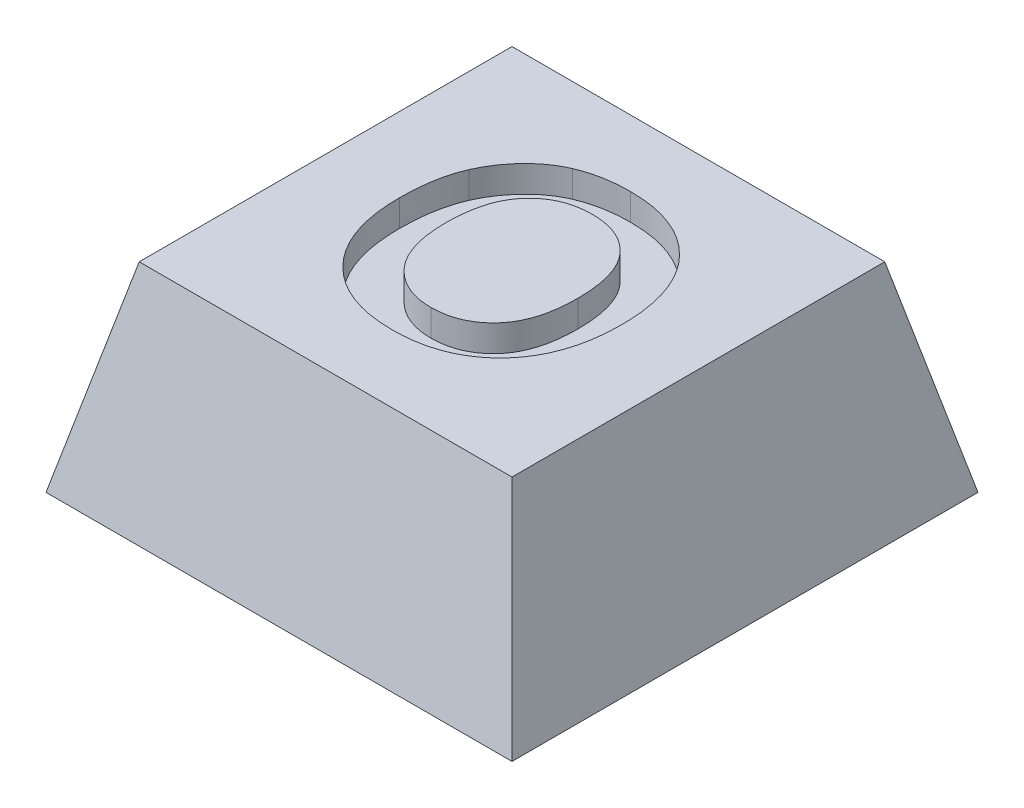
ISO-10303-21;
HEADER;
FILE_DESCRIPTION(('STEP AP214'),'2;1');
FILE_NAME('part.step','',(''),(''),'','','');
FILE_SCHEMA(('AUTOMOTIVE_DESIGN { 1 0 10303 214 1 1 1 1 }'));
ENDSEC;
DATA;
#1=APPLICATION_CONTEXT('core data for automotive mechanical design processes');
#2=APPLICATION_PROTOCOL_DEFINITION('international standard','automotive_design',2000,#1);
#3=PRODUCT_CONTEXT('',#1,'mechanical');
#4=PRODUCT('Part','Part','',(#3));
#5=PRODUCT_RELATED_PRODUCT_CATEGORY('part','',(#4));
#6=PRODUCT_DEFINITION_FORMATION('','',#4);
#7=PRODUCT_DEFINITION_CONTEXT('part definition',#1,'design');
#8=PRODUCT_DEFINITION('design','',#6,#7);
#9=PRODUCT_DEFINITION_SHAPE('','',#8);
#10=(LENGTH_UNIT() NAMED_UNIT(*) SI_UNIT(.MILLI.,.METRE.));
#11=(NAMED_UNIT(*) PLANE_ANGLE_UNIT() SI_UNIT($,.RADIAN.));
#12=(NAMED_UNIT(*) SI_UNIT($,.STERADIAN.) SOLID_ANGLE_UNIT());
#13=UNCERTAINTY_MEASURE_WITH_UNIT(LENGTH_MEASURE(1.E-05),#10,'distance_accuracy_value','');
#14=(GEOMETRIC_REPRESENTATION_CONTEXT(3) GLOBAL_UNCERTAINTY_ASSIGNED_CONTEXT((#13)) GLOBAL_UNIT_ASSIGNED_CONTEXT((#10,
#11,#12)) REPRESENTATION_CONTEXT('',''));
#15=CARTESIAN_POINT('',(0.,0.,0.));
#16=DIRECTION('',(0.,0.,1.));
#17=DIRECTION('',(1.,0.,0.));
#18=AXIS2_PLACEMENT_3D('',#15,#16,#17);
#19=CARTESIAN_POINT('',(0.,3.,0.));
#20=DIRECTION('',(0.,-1.,0.));
#21=DIRECTION('',(0.,0.,-1.));
#22=AXIS2_PLACEMENT_3D('',#19,#20,#21);
#23=PLANE('',#22);
#24=DIRECTION('',(-1.,0.,0.));
#25=VECTOR('',#24,1.);
#26=CARTESIAN_POINT('',(11.,3.,-0.7));
#27=LINE('',#26,#25);
#28=CARTESIAN_POINT('',(6.3,3.,-0.7));
#29=VERTEX_POINT('',#28);
#30=CARTESIAN_POINT('',(0.7,3.,-0.7));
#31=VERTEX_POINT('',#30);
#32=EDGE_CURVE('E300',#29,#31,#27,.T.);
#33=ORIENTED_EDGE('',*,*,#32,.F.);
#34=DIRECTION('',(0.,0.,1.));
#35=VECTOR('',#34,1.);
#36=CARTESIAN_POINT('',(6.3,3.,-7.));
#37=LINE('',#36,#35);
#38=CARTESIAN_POINT('',(6.3,3.,-6.3));
#39=VERTEX_POINT('',#38);
#40=EDGE_CURVE('E312',#39,#29,#37,.T.);
#41=ORIENTED_EDGE('',*,*,#40,.F.);
#42=DIRECTION('',(-1.,0.,0.));
#43=VECTOR('',#42,1.);
#44=CARTESIAN_POINT('',(11.,3.,-6.3));
#45=LINE('',#44,#43);
#46=CARTESIAN_POINT('',(0.699999999999998,3.,-6.3));
#47=VERTEX_POINT('',#46);
#48=EDGE_CURVE('E296',#39,#47,#45,.T.);
#49=ORIENTED_EDGE('',*,*,#48,.T.);
#50=DIRECTION('',(0.,0.,1.));
#51=VECTOR('',#50,1.);
#52=CARTESIAN_POINT('',(0.7,3.,-7.));
#53=LINE('',#52,#51);
#54=EDGE_CURVE('E313',#47,#31,#53,.T.);
#55=ORIENTED_EDGE('',*,*,#54,.T.);
#56=EDGE_LOOP('',(#33,#41,#49,#55));
#57=FACE_BOUND('',#56,.T.);
#58=CARTESIAN_POINT('',(3.4868783656279,3.,-1.7144105566874));
#59=CARTESIAN_POINT('',(3.42488577863911,3.,-1.71596213973714));
#60=CARTESIAN_POINT('',(3.30354847647996,3.,-1.71899903350905));
#61=CARTESIAN_POINT('',(3.12646310417392,3.,-1.74064989999921));
#62=CARTESIAN_POINT('',(2.95924503741864,3.,-1.77775775601154));
#63=CARTESIAN_POINT('',(2.80201335071599,3.,-1.83005335142888));
#64=CARTESIAN_POINT('',(2.65369569519108,3.,-1.89574352108576));
#65=CARTESIAN_POINT('',(2.51566143028609,3.,-1.97751078970332));
#66=CARTESIAN_POINT('',(2.38783425444043,3.,-2.07457615518847));
#67=CARTESIAN_POINT('',(2.2703416712836,3.,-2.18524925836138));
#68=CARTESIAN_POINT('',(2.16382913209137,3.,-2.30845527608443));
#69=CARTESIAN_POINT('',(2.07295207497426,3.,-2.44498024118118));
#70=CARTESIAN_POINT('',(1.99417059212866,3.,-2.59132894507543));
#71=CARTESIAN_POINT('',(1.931542745072,3.,-2.74971822017719));
#72=CARTESIAN_POINT('',(1.88128122169895,3.,-2.9185184438031));
#73=CARTESIAN_POINT('',(1.84702347315421,3.,-3.09870090626541));
#74=CARTESIAN_POINT('',(1.8254060357708,3.,-3.28976969736512));
#75=CARTESIAN_POINT('',(1.82296724088812,3.,-3.4208797622457));
#76=CARTESIAN_POINT('',(1.82171410280738,3.,-3.48824869771304));
#77=B_SPLINE_CURVE_WITH_KNOTS('',3,(#58,#59,#60,#61,#62,#63,#64,#65,#66,#67,#68,#69,#70,#71,#72,
#73,#74,#75,#76),.UNSPECIFIED.,.F.,.F.,(4,1,1,1,1,1,1,1,1,1,1,1,1,1,1,1,4),(0.,
0.0675548908418181,0.132224328755391,0.194080368767538,0.253925152218762,0.312527181287745,
0.370537277971808,0.428355823699205,0.48709717362488,0.546162876751327,0.605432519982998,
0.665482919028343,0.726969728752244,0.790717709645659,0.857154168957074,0.926600817549172,1.),.UNSPECIFIED.);
#78=CARTESIAN_POINT('',(3.4868783656279,3.,-1.7144105566874));
#79=VERTEX_POINT('',#78);
#80=CARTESIAN_POINT('',(1.82171410280738,3.,-3.48824869771304));
#81=VERTEX_POINT('',#80);
#82=EDGE_CURVE('E59',#79,#81,#77,.T.);
#83=ORIENTED_EDGE('',*,*,#82,.T.);
#84=CARTESIAN_POINT('',(1.82171410280738,3.,-3.48824869771304));
#85=CARTESIAN_POINT('',(1.82196178350956,3.,-3.53150025323456));
#86=CARTESIAN_POINT('',(1.82244819643745,3.,-3.61644072527134));
#87=CARTESIAN_POINT('',(1.83087660364378,3.,-3.74105158658262));
#88=CARTESIAN_POINT('',(1.84198590096817,3.,-3.86049574990482));
#89=CARTESIAN_POINT('',(1.86007737378861,3.,-3.97430339719521));
#90=CARTESIAN_POINT('',(1.88135955079986,3.,-4.08300718725822));
#91=CARTESIAN_POINT('',(1.90797790586073,3.,-4.18657485331883));
#92=CARTESIAN_POINT('',(1.94004359780977,3.,-4.28464318629066));
#93=CARTESIAN_POINT('',(1.96555210950307,3.,-4.34725875692655));
#94=CARTESIAN_POINT('',(1.97806426306379,3.,-4.37797225540535));
#95=B_SPLINE_CURVE_WITH_KNOTS('',3,(#84,#85,#86,#87,#88,#89,#90,#91,#92,#93,#94),.UNSPECIFIED.,
.F.,.F.,(4,1,1,1,1,1,1,1,4),(0.,0.142626151542261,0.280099351126508,0.41179758440464,
0.538153649343746,0.660001734469281,0.777041667829733,0.890636940198671,1.),.UNSPECIFIED.);
#96=CARTESIAN_POINT('',(1.97806426306379,3.,-4.37797225540535));
#97=VERTEX_POINT('',#96);
#98=EDGE_CURVE('E225',#81,#97,#95,.T.);
#99=ORIENTED_EDGE('',*,*,#98,.T.);
#100=CARTESIAN_POINT('',(1.97806426306379,3.,-4.37797225540535));
#101=CARTESIAN_POINT('',(1.998516885688,3.,-4.42163505106402));
#102=CARTESIAN_POINT('',(2.03918157465484,3.,-4.50844709651686));
#103=CARTESIAN_POINT('',(2.11470229330953,3.,-4.63111949568779));
#104=CARTESIAN_POINT('',(2.20030057519163,3.,-4.7468095075435));
#105=CARTESIAN_POINT('',(2.2952717129761,3.,-4.85491063757016));
#106=CARTESIAN_POINT('',(2.39719106357061,3.,-4.95379548370455));
#107=CARTESIAN_POINT('',(2.50653943506425,3.,-5.03842667387064));
#108=CARTESIAN_POINT('',(2.61943200816132,3.,-5.11166238307809));
#109=CARTESIAN_POINT('',(2.69972425714822,3.,-5.14849559193813));
#110=CARTESIAN_POINT('',(2.73948253229456,3.,-5.16673427463612));
#111=B_SPLINE_CURVE_WITH_KNOTS('',3,(#100,#101,#102,#103,#104,#105,#106,#107,#108,#109,#110),
.UNSPECIFIED.,.F.,.F.,(4,1,1,1,1,1,1,1,4),(0.,0.128921537361802,0.256326746660807,
0.384644817223719,0.513589100227115,0.640960544758506,0.763920863448044,0.883100805049367,1.),.UNSPECIFIED.);
#112=CARTESIAN_POINT('',(2.73948253229456,3.,-5.16673427463612));
#113=VERTEX_POINT('',#112);
#114=EDGE_CURVE('E234',#97,#113,#111,.T.);
#115=ORIENTED_EDGE('',*,*,#114,.T.);
#116=CARTESIAN_POINT('',(2.73948253229456,3.,-5.16673427463612));
#117=CARTESIAN_POINT('',(2.76647030053949,3.,-5.17780405499253));
#118=CARTESIAN_POINT('',(2.82101946139793,3.,-5.20017890362207));
#119=CARTESIAN_POINT('',(2.90579527825329,3.,-5.22810388710177));
#120=CARTESIAN_POINT('',(2.99378772937256,3.,-5.25079167393255));
#121=CARTESIAN_POINT('',(3.08436037093094,3.,-5.27107191199034));
#122=CARTESIAN_POINT('',(3.1783925876963,3.,-5.28505580345063));
#123=CARTESIAN_POINT('',(3.27512456000823,3.,-5.2967808157109));
#124=CARTESIAN_POINT('',(3.37508566911623,3.,-5.30292609864419));
#125=CARTESIAN_POINT('',(3.44270063077777,3.,-5.30374034510211));
#126=CARTESIAN_POINT('',(3.47706266049969,3.,-5.30415414643099));
#127=B_SPLINE_CURVE_WITH_KNOTS('',3,(#116,#117,#118,#119,#120,#121,#122,#123,#124,#125,#126),
.UNSPECIFIED.,.F.,.F.,(4,1,1,1,1,1,1,1,4),(0.,0.11582419245917,0.234110225358943,
0.354106367101145,0.47662819764766,0.602520909154957,0.73146627476947,0.863530739041159,1.),.UNSPECIFIED.);
#128=CARTESIAN_POINT('',(3.47706266049969,3.,-5.30415414643099));
#129=VERTEX_POINT('',#128);
#130=EDGE_CURVE('E243',#113,#129,#127,.T.);
#131=ORIENTED_EDGE('',*,*,#130,.T.);
#132=CARTESIAN_POINT('',(3.47706266049969,3.,-5.30415414643099));
#133=CARTESIAN_POINT('',(3.53859053571245,3.,-5.30261184463026));
#134=CARTESIAN_POINT('',(3.65900143315827,3.,-5.29959353880844));
#135=CARTESIAN_POINT('',(3.83488794116481,3.,-5.27779267481563));
#136=CARTESIAN_POINT('',(4.00132998116081,3.,-5.24097990896327));
#137=CARTESIAN_POINT('',(4.15776414390691,3.,-5.18777181733149));
#138=CARTESIAN_POINT('',(4.30553915653759,3.,-5.12126054798245));
#139=CARTESIAN_POINT('',(4.44350689488217,3.,-5.0387608923831));
#140=CARTESIAN_POINT('',(4.57187155432904,3.,-4.9411657490069));
#141=CARTESIAN_POINT('',(4.69038520489811,3.,-4.82981346068601));
#142=CARTESIAN_POINT('',(4.79711523595804,3.,-4.70489808627424));
#143=CARTESIAN_POINT('',(4.89006822616152,3.,-4.56758652213554));
#144=CARTESIAN_POINT('',(4.96804321811465,3.,-4.41852222250959));
#145=CARTESIAN_POINT('',(5.03226012610551,3.,-4.25811646270797));
#146=CARTESIAN_POINT('',(5.08160598083309,3.,-4.08584530704998));
#147=CARTESIAN_POINT('',(5.11725831514555,3.,-3.90219483545387));
#148=CARTESIAN_POINT('',(5.13843868794543,3.,-3.70702977469054));
#149=CARTESIAN_POINT('',(5.14094152899522,3.,-3.57313789818657));
#150=CARTESIAN_POINT('',(5.14222692332021,3.,-3.50437449899509));
#151=B_SPLINE_CURVE_WITH_KNOTS('',3,(#132,#133,#134,#135,#136,#137,#138,#139,#140,#141,#142,
#143,#144,#145,#146,#147,#148,#149,#150),.UNSPECIFIED.,.F.,.F.,(4,1,1,1,1,1,1,1,1,1,1,1,1,1,1,1,
4),(0.,0.0665400640507846,0.130219819890614,0.19136249355442,0.250596308078881,
0.308629701058001,0.366331271590809,0.424067714983998,0.482723185884521,0.541891699233788,
0.601416067240712,0.661683488488139,0.723504318995045,0.787984312988148,0.855208444610935,
0.925638808098423,1.),.UNSPECIFIED.);
#152=CARTESIAN_POINT('',(5.14222692332021,3.,-3.50437449899509));
#153=VERTEX_POINT('',#152);
#154=EDGE_CURVE('E252',#129,#153,#151,.T.);
#155=ORIENTED_EDGE('',*,*,#154,.T.);
#156=CARTESIAN_POINT('',(5.14222692332021,3.,-3.50437449899509));
#157=CARTESIAN_POINT('',(5.14097121768169,3.,-3.43607154917613));
#158=CARTESIAN_POINT('',(5.13852659340614,3.,-3.30309846687242));
#159=CARTESIAN_POINT('',(5.11695087590904,3.,-3.10946487462891));
#160=CARTESIAN_POINT('',(5.08277663491198,3.,-2.92715322030312));
#161=CARTESIAN_POINT('',(5.03223680702889,3.,-2.75657997001343));
#162=CARTESIAN_POINT('',(4.96993650429565,3.,-2.59644353598003));
#163=CARTESIAN_POINT('',(4.8911591302425,3.,-2.44865127090717));
#164=CARTESIAN_POINT('',(4.80015285598484,3.,-2.31124280762863));
#165=CARTESIAN_POINT('',(4.69357441541846,3.,-2.18767349426659));
#166=CARTESIAN_POINT('',(4.57705541683294,3.,-2.07568215480642));
#167=CARTESIAN_POINT('',(4.44885358148483,3.,-1.97922765321011));
#168=CARTESIAN_POINT('',(4.3118901804038,3.,-1.89661621486118));
#169=CARTESIAN_POINT('',(4.16492086490947,3.,-1.8299127385405));
#170=CARTESIAN_POINT('',(4.00890355395947,3.,-1.77780044870118));
#171=CARTESIAN_POINT('',(3.8433290955586,3.,-1.74070480373075));
#172=CARTESIAN_POINT('',(3.66811257080752,3.,-1.71898783232248));
#173=CARTESIAN_POINT('',(3.54817083189095,3.,-1.7159585675177));
#174=CARTESIAN_POINT('',(3.4868783656279,3.,-1.7144105566874));
#175=B_SPLINE_CURVE_WITH_KNOTS('',3,(#156,#157,#158,#159,#160,#161,#162,#163,#164,#165,#166,
#167,#168,#169,#170,#171,#172,#173,#174),.UNSPECIFIED.,.F.,.F.,(4,1,1,1,1,1,1,1,1,1,1,1,1,1,1,1,
4),(0.,0.0742781575154445,0.144605695344774,0.211666548904063,0.275782984734484,
0.337863098902652,0.398250193305316,0.457619965753242,0.516768332552388,0.575389852409409,
0.633100216613373,0.690913523227109,0.749047349975616,0.808297797028934,0.869542001331225,
0.933333528808403,1.),.UNSPECIFIED.);
#176=EDGE_CURVE('E261',#153,#79,#175,.T.);
#177=ORIENTED_EDGE('',*,*,#176,.T.);
#178=EDGE_LOOP('',(#83,#99,#115,#131,#155,#177));
#179=FACE_BOUND('',#178,.T.);
#180=ADVANCED_FACE('F43',(#57,#179),#23,.F.);
#181=CARTESIAN_POINT('',(7.,0.,-7.));
#182=DIRECTION('',(-0.973841209741793,-0.227229615606418,0.));
#183=DIRECTION('',(0.227229615606418,-0.973841209741793,0.));
#184=AXIS2_PLACEMENT_3D('',#181,#182,#183);
#185=PLANE('',#184);
#186=DIRECTION('',(-0.221581128241521,0.949633406749377,-0.221581128241521));
#187=VECTOR('',#186,1.);
#188=CARTESIAN_POINT('',(6.6563126252505,1.47294589178357,-0.343687374749499));
#189=LINE('',#188,#187);
#190=CARTESIAN_POINT('',(7.,0.,0.));
#191=VERTEX_POINT('',#190);
#192=EDGE_CURVE('E309',#191,#29,#189,.T.);
#193=ORIENTED_EDGE('',*,*,#192,.F.);
#194=DIRECTION('',(0.,0.,-1.));
#195=VECTOR('',#194,1.);
#196=CARTESIAN_POINT('',(7.,0.,0.));
#197=LINE('',#196,#195);
#198=CARTESIAN_POINT('',(7.,0.,-7.));
#199=VERTEX_POINT('',#198);
#200=EDGE_CURVE('E327',#191,#199,#197,.T.);
#201=ORIENTED_EDGE('',*,*,#200,.T.);
#202=DIRECTION('',(0.221581128241521,-0.949633406749377,-0.221581128241521));
#203=VECTOR('',#202,1.);
#204=CARTESIAN_POINT('',(7.,0.,-7.));
#205=LINE('',#204,#203);
#206=EDGE_CURVE('E303',#39,#199,#205,.T.);
#207=ORIENTED_EDGE('',*,*,#206,.F.);
#208=ORIENTED_EDGE('',*,*,#40,.T.);
#209=EDGE_LOOP('',(#193,#201,#207,#208));
#210=FACE_BOUND('',#209,.T.);
#211=ADVANCED_FACE('F353',(#210),#185,.F.);
#212=CARTESIAN_POINT('',(0.,0.,-7.));
#213=DIRECTION('',(0.973841209741793,-0.227229615606418,0.));
#214=DIRECTION('',(0.227229615606418,0.973841209741793,0.));
#215=AXIS2_PLACEMENT_3D('',#212,#213,#214);
#216=PLANE('',#215);
#217=DIRECTION('',(-0.221581128241521,-0.949633406749378,0.221581128241521));
#218=VECTOR('',#217,1.);
#219=CARTESIAN_POINT('',(0.343687374749499,1.47294589178357,-0.3436873747495));
#220=LINE('',#219,#218);
#221=CARTESIAN_POINT('',(0.,0.,0.));
#222=VERTEX_POINT('',#221);
#223=EDGE_CURVE('E11',#31,#222,#220,.T.);
#224=ORIENTED_EDGE('',*,*,#223,.F.);
#225=ORIENTED_EDGE('',*,*,#54,.F.);
#226=DIRECTION('',(0.221581128241521,0.949633406749377,0.221581128241521));
#227=VECTOR('',#226,1.);
#228=CARTESIAN_POINT('',(0.,0.,-7.));
#229=LINE('',#228,#227);
#230=CARTESIAN_POINT('',(0.,0.,-7.));
#231=VERTEX_POINT('',#230);
#232=EDGE_CURVE('E52',#231,#47,#229,.T.);
#233=ORIENTED_EDGE('',*,*,#232,.F.);
#234=DIRECTION('',(0.,0.,1.));
#235=VECTOR('',#234,1.);
#236=CARTESIAN_POINT('',(0.,0.,0.));
#237=LINE('',#236,#235);
#238=EDGE_CURVE('E317',#231,#222,#237,.T.);
#239=ORIENTED_EDGE('',*,*,#238,.T.);
#240=EDGE_LOOP('',(#224,#225,#233,#239));
#241=FACE_BOUND('',#240,.T.);
#242=ADVANCED_FACE('F347',(#241),#216,.F.);
#243=CARTESIAN_POINT('',(0.,0.,0.));
#244=DIRECTION('',(0.,-1.,0.));
#245=DIRECTION('',(0.,0.,-1.));
#246=AXIS2_PLACEMENT_3D('',#243,#244,#245);
#247=PLANE('',#246);
#248=CARTESIAN_POINT('',(3.5,0.,-3.5));
#249=DIRECTION('',(0.,-1.,0.));
#250=DIRECTION('',(0.,0.,-1.));
#251=AXIS2_PLACEMENT_3D('',#248,#249,#250);
#252=CIRCLE('',#251,1.8);
#253=CARTESIAN_POINT('',(3.5,0.,-5.3));
#254=VERTEX_POINT('',#253);
#255=EDGE_CURVE('E291',#254,#254,#252,.T.);
#256=ORIENTED_EDGE('',*,*,#255,.F.);
#257=EDGE_LOOP('',(#256));
#258=FACE_BOUND('',#257,.T.);
#259=ORIENTED_EDGE('',*,*,#238,.F.);
#260=DIRECTION('',(-1.,0.,0.));
#261=VECTOR('',#260,1.);
#262=CARTESIAN_POINT('',(0.,0.,-7.));
#263=LINE('',#262,#261);
#264=EDGE_CURVE('E331',#199,#231,#263,.T.);
#265=ORIENTED_EDGE('',*,*,#264,.F.);
#266=ORIENTED_EDGE('',*,*,#200,.F.);
#267=DIRECTION('',(1.,0.,0.));
#268=VECTOR('',#267,1.);
#269=CARTESIAN_POINT('',(0.,0.,0.));
#270=LINE('',#269,#268);
#271=EDGE_CURVE('E324',#222,#191,#270,.T.);
#272=ORIENTED_EDGE('',*,*,#271,.F.);
#273=EDGE_LOOP('',(#259,#265,#266,#272));
#274=FACE_BOUND('',#273,.T.);
#275=ADVANCED_FACE('F45',(#258,#274),#247,.T.);
#276=CARTESIAN_POINT('',(11.,3.,-6.3));
#277=DIRECTION('',(0.,0.227229615606418,-0.973841209741793));
#278=DIRECTION('',(0.,0.973841209741793,0.227229615606418));
#279=AXIS2_PLACEMENT_3D('',#276,#277,#278);
#280=PLANE('',#279);
#281=ORIENTED_EDGE('',*,*,#206,.T.);
#282=ORIENTED_EDGE('',*,*,#264,.T.);
#283=ORIENTED_EDGE('',*,*,#232,.T.);
#284=ORIENTED_EDGE('',*,*,#48,.F.);
#285=EDGE_LOOP('',(#281,#282,#283,#284));
#286=FACE_BOUND('',#285,.T.);
#287=ADVANCED_FACE('F336',(#286),#280,.T.);
#288=CARTESIAN_POINT('',(11.,0.,0.));
#289=DIRECTION('',(0.,0.227229615606418,0.973841209741793));
#290=DIRECTION('',(0.,-0.973841209741793,0.227229615606418));
#291=AXIS2_PLACEMENT_3D('',#288,#289,#290);
#292=PLANE('',#291);
#293=ORIENTED_EDGE('',*,*,#192,.T.);
#294=ORIENTED_EDGE('',*,*,#32,.T.);
#295=ORIENTED_EDGE('',*,*,#223,.T.);
#296=ORIENTED_EDGE('',*,*,#271,.T.);
#297=EDGE_LOOP('',(#293,#294,#295,#296));
#298=FACE_BOUND('',#297,.T.);
#299=ADVANCED_FACE('F350',(#298),#292,.T.);
#300=CARTESIAN_POINT('',(3.5,0.8,-3.5));
#301=DIRECTION('',(0.,-1.,0.));
#302=DIRECTION('',(0.,0.,-1.));
#303=AXIS2_PLACEMENT_3D('',#300,#301,#302);
#304=CYLINDRICAL_SURFACE('',#303,1.8);
#305=CARTESIAN_POINT('',(3.5,0.8,-3.5));
#306=DIRECTION('',(0.,-1.,0.));
#307=DIRECTION('',(0.,0.,-1.));
#308=AXIS2_PLACEMENT_3D('',#305,#306,#307);
#309=CIRCLE('',#308,1.8);
#310=CARTESIAN_POINT('',(3.5,0.8,-5.3));
#311=VERTEX_POINT('',#310);
#312=EDGE_CURVE('E292',#311,#311,#309,.T.);
#313=ORIENTED_EDGE('',*,*,#312,.F.);
#314=EDGE_LOOP('',(#313));
#315=FACE_BOUND('',#314,.T.);
#316=ORIENTED_EDGE('',*,*,#255,.T.);
#317=EDGE_LOOP('',(#316));
#318=FACE_BOUND('',#317,.T.);
#319=ADVANCED_FACE('F441',(#315,#318),#304,.F.);
#320=CARTESIAN_POINT('',(3.5,0.8,-3.5));
#321=DIRECTION('',(0.,-1.,0.));
#322=DIRECTION('',(0.,0.,-1.));
#323=AXIS2_PLACEMENT_3D('',#320,#321,#322);
#324=PLANE('',#323);
#325=ORIENTED_EDGE('',*,*,#312,.T.);
#326=EDGE_LOOP('',(#325));
#327=FACE_BOUND('',#326,.T.);
#328=ADVANCED_FACE('F437',(#327),#324,.T.);
#329=CARTESIAN_POINT('',(3.4868783656279,2.6,-1.7144105566874));
#330=CARTESIAN_POINT('',(3.42488577863911,2.6,-1.71596213973714));
#331=CARTESIAN_POINT('',(3.30354847647996,2.6,-1.71899903350905));
#332=CARTESIAN_POINT('',(3.12646310417392,2.6,-1.74064989999921));
#333=CARTESIAN_POINT('',(2.95924503741864,2.6,-1.77775775601154));
#334=CARTESIAN_POINT('',(2.80201335071599,2.6,-1.83005335142888));
#335=CARTESIAN_POINT('',(2.65369569519108,2.6,-1.89574352108576));
#336=CARTESIAN_POINT('',(2.51566143028609,2.6,-1.97751078970332));
#337=CARTESIAN_POINT('',(2.38783425444043,2.6,-2.07457615518847));
#338=CARTESIAN_POINT('',(2.2703416712836,2.6,-2.18524925836138));
#339=CARTESIAN_POINT('',(2.16382913209137,2.6,-2.30845527608443));
#340=CARTESIAN_POINT('',(2.07295207497426,2.6,-2.44498024118118));
#341=CARTESIAN_POINT('',(1.99417059212866,2.6,-2.59132894507543));
#342=CARTESIAN_POINT('',(1.931542745072,2.6,-2.74971822017719));
#343=CARTESIAN_POINT('',(1.88128122169895,2.6,-2.9185184438031));
#344=CARTESIAN_POINT('',(1.84702347315421,2.6,-3.09870090626541));
#345=CARTESIAN_POINT('',(1.8254060357708,2.6,-3.28976969736512));
#346=CARTESIAN_POINT('',(1.82296724088812,2.6,-3.4208797622457));
#347=CARTESIAN_POINT('',(1.82171410280738,2.6,-3.48824869771304));
#348=B_SPLINE_CURVE_WITH_KNOTS('',3,(#329,#330,#331,#332,#333,#334,#335,#336,#337,#338,#339,
#340,#341,#342,#343,#344,#345,#346,#347),.UNSPECIFIED.,.F.,.F.,(4,1,1,1,1,1,1,1,1,1,1,1,1,1,1,1,
4),(0.,0.0675548908418181,0.132224328755391,0.194080368767538,0.253925152218762,
0.312527181287745,0.370537277971808,0.428355823699205,0.48709717362488,0.546162876751327,
0.605432519982998,0.665482919028343,0.726969728752244,0.790717709645659,0.857154168957074,
0.926600817549172,1.),.UNSPECIFIED.);
#349=DIRECTION('',(0.,1.,0.));
#350=VECTOR('',#349,1.);
#351=SURFACE_OF_LINEAR_EXTRUSION('',#348,#350);
#352=ORIENTED_EDGE('',*,*,#82,.F.);
#353=DIRECTION('',(0.,1.,0.));
#354=VECTOR('',#353,1.);
#355=CARTESIAN_POINT('',(3.4868783656279,2.6,-1.7144105566874));
#356=LINE('',#355,#354);
#357=CARTESIAN_POINT('',(3.4868783656279,2.6,-1.7144105566874));
#358=VERTEX_POINT('',#357);
#359=EDGE_CURVE('E212',#358,#79,#356,.T.);
#360=ORIENTED_EDGE('',*,*,#359,.F.);
#361=CARTESIAN_POINT('',(1.82171410280738,2.6,-3.48824869771304));
#362=VERTEX_POINT('',#361);
#363=EDGE_CURVE('E270',#358,#362,#348,.T.);
#364=ORIENTED_EDGE('',*,*,#363,.T.);
#365=DIRECTION('',(0.,1.,0.));
#366=VECTOR('',#365,1.);
#367=CARTESIAN_POINT('',(1.82171410280738,2.6,-3.48824869771304));
#368=LINE('',#367,#366);
#369=EDGE_CURVE('E288',#362,#81,#368,.T.);
#370=ORIENTED_EDGE('',*,*,#369,.T.);
#371=EDGE_LOOP('',(#352,#360,#364,#370));
#372=FACE_BOUND('',#371,.T.);
#373=ADVANCED_FACE('F432',(#372),#351,.T.);
#374=CARTESIAN_POINT('',(1.82171410280738,2.6,-3.48824869771304));
#375=CARTESIAN_POINT('',(1.82196178350956,2.6,-3.53150025323456));
#376=CARTESIAN_POINT('',(1.82244819643745,2.6,-3.61644072527134));
#377=CARTESIAN_POINT('',(1.83087660364378,2.6,-3.74105158658262));
#378=CARTESIAN_POINT('',(1.84198590096817,2.6,-3.86049574990482));
#379=CARTESIAN_POINT('',(1.86007737378861,2.6,-3.97430339719521));
#380=CARTESIAN_POINT('',(1.88135955079986,2.6,-4.08300718725822));
#381=CARTESIAN_POINT('',(1.90797790586073,2.6,-4.18657485331883));
#382=CARTESIAN_POINT('',(1.94004359780977,2.6,-4.28464318629066));
#383=CARTESIAN_POINT('',(1.96555210950307,2.6,-4.34725875692655));
#384=CARTESIAN_POINT('',(1.97806426306379,2.6,-4.37797225540535));
#385=B_SPLINE_CURVE_WITH_KNOTS('',3,(#374,#375,#376,#377,#378,#379,#380,#381,#382,#383,#384),
.UNSPECIFIED.,.F.,.F.,(4,1,1,1,1,1,1,1,4),(0.,0.142626151542261,0.280099351126508,
0.41179758440464,0.538153649343746,0.660001734469281,0.777041667829733,0.890636940198671,1.),.UNSPECIFIED.);
#386=DIRECTION('',(0.,1.,0.));
#387=VECTOR('',#386,1.);
#388=SURFACE_OF_LINEAR_EXTRUSION('',#385,#387);
#389=ORIENTED_EDGE('',*,*,#98,.F.);
#390=ORIENTED_EDGE('',*,*,#369,.F.);
#391=CARTESIAN_POINT('',(1.97806426306379,2.6,-4.37797225540535));
#392=VERTEX_POINT('',#391);
#393=EDGE_CURVE('E423',#362,#392,#385,.T.);
#394=ORIENTED_EDGE('',*,*,#393,.T.);
#395=DIRECTION('',(0.,1.,0.));
#396=VECTOR('',#395,1.);
#397=CARTESIAN_POINT('',(1.97806426306379,2.6,-4.37797225540535));
#398=LINE('',#397,#396);
#399=EDGE_CURVE('E285',#392,#97,#398,.T.);
#400=ORIENTED_EDGE('',*,*,#399,.T.);
#401=EDGE_LOOP('',(#389,#390,#394,#400));
#402=FACE_BOUND('',#401,.T.);
#403=ADVANCED_FACE('F436',(#402),#388,.T.);
#404=CARTESIAN_POINT('',(1.97806426306379,2.6,-4.37797225540535));
#405=CARTESIAN_POINT('',(1.998516885688,2.6,-4.42163505106402));
#406=CARTESIAN_POINT('',(2.03918157465484,2.6,-4.50844709651686));
#407=CARTESIAN_POINT('',(2.11470229330953,2.6,-4.63111949568779));
#408=CARTESIAN_POINT('',(2.20030057519163,2.6,-4.7468095075435));
#409=CARTESIAN_POINT('',(2.2952717129761,2.6,-4.85491063757016));
#410=CARTESIAN_POINT('',(2.39719106357061,2.6,-4.95379548370455));
#411=CARTESIAN_POINT('',(2.50653943506425,2.6,-5.03842667387064));
#412=CARTESIAN_POINT('',(2.61943200816132,2.6,-5.11166238307809));
#413=CARTESIAN_POINT('',(2.69972425714822,2.6,-5.14849559193813));
#414=CARTESIAN_POINT('',(2.73948253229456,2.6,-5.16673427463612));
#415=B_SPLINE_CURVE_WITH_KNOTS('',3,(#404,#405,#406,#407,#408,#409,#410,#411,#412,#413,#414),
.UNSPECIFIED.,.F.,.F.,(4,1,1,1,1,1,1,1,4),(0.,0.128921537361802,0.256326746660807,
0.384644817223719,0.513589100227115,0.640960544758506,0.763920863448044,0.883100805049367,1.),.UNSPECIFIED.);
#416=DIRECTION('',(0.,1.,0.));
#417=VECTOR('',#416,1.);
#418=SURFACE_OF_LINEAR_EXTRUSION('',#415,#417);
#419=ORIENTED_EDGE('',*,*,#114,.F.);
#420=ORIENTED_EDGE('',*,*,#399,.F.);
#421=CARTESIAN_POINT('',(2.73948253229456,2.6,-5.16673427463612));
#422=VERTEX_POINT('',#421);
#423=EDGE_CURVE('E625',#392,#422,#415,.T.);
#424=ORIENTED_EDGE('',*,*,#423,.T.);
#425=DIRECTION('',(0.,1.,0.));
#426=VECTOR('',#425,1.);
#427=CARTESIAN_POINT('',(2.73948253229456,2.6,-5.16673427463612));
#428=LINE('',#427,#426);
#429=EDGE_CURVE('E282',#422,#113,#428,.T.);
#430=ORIENTED_EDGE('',*,*,#429,.T.);
#431=EDGE_LOOP('',(#419,#420,#424,#430));
#432=FACE_BOUND('',#431,.T.);
#433=ADVANCED_FACE('F469',(#432),#418,.T.);
#434=CARTESIAN_POINT('',(2.73948253229456,2.6,-5.16673427463612));
#435=CARTESIAN_POINT('',(2.76647030053949,2.6,-5.17780405499253));
#436=CARTESIAN_POINT('',(2.82101946139793,2.6,-5.20017890362207));
#437=CARTESIAN_POINT('',(2.90579527825329,2.6,-5.22810388710177));
#438=CARTESIAN_POINT('',(2.99378772937256,2.6,-5.25079167393255));
#439=CARTESIAN_POINT('',(3.08436037093094,2.6,-5.27107191199034));
#440=CARTESIAN_POINT('',(3.1783925876963,2.6,-5.28505580345063));
#441=CARTESIAN_POINT('',(3.27512456000823,2.6,-5.2967808157109));
#442=CARTESIAN_POINT('',(3.37508566911623,2.6,-5.30292609864419));
#443=CARTESIAN_POINT('',(3.44270063077777,2.6,-5.30374034510211));
#444=CARTESIAN_POINT('',(3.47706266049969,2.6,-5.30415414643099));
#445=B_SPLINE_CURVE_WITH_KNOTS('',3,(#434,#435,#436,#437,#438,#439,#440,#441,#442,#443,#444),
.UNSPECIFIED.,.F.,.F.,(4,1,1,1,1,1,1,1,4),(0.,0.11582419245917,0.234110225358943,
0.354106367101145,0.47662819764766,0.602520909154957,0.73146627476947,0.863530739041159,1.),.UNSPECIFIED.);
#446=DIRECTION('',(0.,1.,0.));
#447=VECTOR('',#446,1.);
#448=SURFACE_OF_LINEAR_EXTRUSION('',#445,#447);
#449=ORIENTED_EDGE('',*,*,#130,.F.);
#450=ORIENTED_EDGE('',*,*,#429,.F.);
#451=CARTESIAN_POINT('',(3.47706266049969,2.6,-5.30415414643099));
#452=VERTEX_POINT('',#451);
#453=EDGE_CURVE('E627',#422,#452,#445,.T.);
#454=ORIENTED_EDGE('',*,*,#453,.T.);
#455=DIRECTION('',(0.,1.,0.));
#456=VECTOR('',#455,1.);
#457=CARTESIAN_POINT('',(3.47706266049969,2.6,-5.30415414643099));
#458=LINE('',#457,#456);
#459=EDGE_CURVE('E279',#452,#129,#458,.T.);
#460=ORIENTED_EDGE('',*,*,#459,.T.);
#461=EDGE_LOOP('',(#449,#450,#454,#460));
#462=FACE_BOUND('',#461,.T.);
#463=ADVANCED_FACE('F476',(#462),#448,.T.);
#464=CARTESIAN_POINT('',(3.47706266049969,2.6,-5.30415414643099));
#465=CARTESIAN_POINT('',(3.53859053571245,2.6,-5.30261184463026));
#466=CARTESIAN_POINT('',(3.65900143315827,2.6,-5.29959353880844));
#467=CARTESIAN_POINT('',(3.83488794116481,2.6,-5.27779267481563));
#468=CARTESIAN_POINT('',(4.00132998116081,2.6,-5.24097990896327));
#469=CARTESIAN_POINT('',(4.15776414390691,2.6,-5.18777181733149));
#470=CARTESIAN_POINT('',(4.30553915653759,2.6,-5.12126054798245));
#471=CARTESIAN_POINT('',(4.44350689488217,2.6,-5.0387608923831));
#472=CARTESIAN_POINT('',(4.57187155432904,2.6,-4.9411657490069));
#473=CARTESIAN_POINT('',(4.69038520489811,2.6,-4.82981346068601));
#474=CARTESIAN_POINT('',(4.79711523595804,2.6,-4.70489808627424));
#475=CARTESIAN_POINT('',(4.89006822616152,2.6,-4.56758652213554));
#476=CARTESIAN_POINT('',(4.96804321811465,2.6,-4.41852222250959));
#477=CARTESIAN_POINT('',(5.03226012610551,2.6,-4.25811646270797));
#478=CARTESIAN_POINT('',(5.08160598083309,2.6,-4.08584530704998));
#479=CARTESIAN_POINT('',(5.11725831514555,2.6,-3.90219483545387));
#480=CARTESIAN_POINT('',(5.13843868794543,2.6,-3.70702977469054));
#481=CARTESIAN_POINT('',(5.14094152899522,2.6,-3.57313789818657));
#482=CARTESIAN_POINT('',(5.14222692332021,2.6,-3.50437449899509));
#483=B_SPLINE_CURVE_WITH_KNOTS('',3,(#464,#465,#466,#467,#468,#469,#470,#471,#472,#473,#474,
#475,#476,#477,#478,#479,#480,#481,#482),.UNSPECIFIED.,.F.,.F.,(4,1,1,1,1,1,1,1,1,1,1,1,1,1,1,1,
4),(0.,0.0665400640507846,0.130219819890614,0.19136249355442,0.250596308078881,
0.308629701058001,0.366331271590809,0.424067714983998,0.482723185884521,0.541891699233788,
0.601416067240712,0.661683488488139,0.723504318995045,0.787984312988148,0.855208444610935,
0.925638808098423,1.),.UNSPECIFIED.);
#484=DIRECTION('',(0.,1.,0.));
#485=VECTOR('',#484,1.);
#486=SURFACE_OF_LINEAR_EXTRUSION('',#483,#485);
#487=ORIENTED_EDGE('',*,*,#154,.F.);
#488=ORIENTED_EDGE('',*,*,#459,.F.);
#489=CARTESIAN_POINT('',(5.14222692332021,2.6,-3.50437449899509));
#490=VERTEX_POINT('',#489);
#491=EDGE_CURVE('E213',#452,#490,#483,.T.);
#492=ORIENTED_EDGE('',*,*,#491,.T.);
#493=DIRECTION('',(0.,1.,0.));
#494=VECTOR('',#493,1.);
#495=CARTESIAN_POINT('',(5.14222692332021,2.6,-3.50437449899509));
#496=LINE('',#495,#494);
#497=EDGE_CURVE('E276',#490,#153,#496,.T.);
#498=ORIENTED_EDGE('',*,*,#497,.T.);
#499=EDGE_LOOP('',(#487,#488,#492,#498));
#500=FACE_BOUND('',#499,.T.);
#501=ADVANCED_FACE('F202',(#500),#486,.T.);
#502=CARTESIAN_POINT('',(5.14222692332021,2.6,-3.50437449899509));
#503=CARTESIAN_POINT('',(5.14097121768169,2.6,-3.43607154917613));
#504=CARTESIAN_POINT('',(5.13852659340614,2.6,-3.30309846687242));
#505=CARTESIAN_POINT('',(5.11695087590904,2.6,-3.10946487462891));
#506=CARTESIAN_POINT('',(5.08277663491198,2.6,-2.92715322030312));
#507=CARTESIAN_POINT('',(5.03223680702889,2.6,-2.75657997001343));
#508=CARTESIAN_POINT('',(4.96993650429565,2.6,-2.59644353598003));
#509=CARTESIAN_POINT('',(4.8911591302425,2.6,-2.44865127090717));
#510=CARTESIAN_POINT('',(4.80015285598484,2.6,-2.31124280762863));
#511=CARTESIAN_POINT('',(4.69357441541846,2.6,-2.18767349426659));
#512=CARTESIAN_POINT('',(4.57705541683294,2.6,-2.07568215480642));
#513=CARTESIAN_POINT('',(4.44885358148483,2.6,-1.97922765321011));
#514=CARTESIAN_POINT('',(4.3118901804038,2.6,-1.89661621486118));
#515=CARTESIAN_POINT('',(4.16492086490947,2.6,-1.8299127385405));
#516=CARTESIAN_POINT('',(4.00890355395947,2.6,-1.77780044870118));
#517=CARTESIAN_POINT('',(3.8433290955586,2.6,-1.74070480373075));
#518=CARTESIAN_POINT('',(3.66811257080752,2.6,-1.71898783232248));
#519=CARTESIAN_POINT('',(3.54817083189095,2.6,-1.7159585675177));
#520=CARTESIAN_POINT('',(3.4868783656279,2.6,-1.7144105566874));
#521=B_SPLINE_CURVE_WITH_KNOTS('',3,(#502,#503,#504,#505,#506,#507,#508,#509,#510,#511,#512,
#513,#514,#515,#516,#517,#518,#519,#520),.UNSPECIFIED.,.F.,.F.,(4,1,1,1,1,1,1,1,1,1,1,1,1,1,1,1,
4),(0.,0.0742781575154445,0.144605695344774,0.211666548904063,0.275782984734484,
0.337863098902652,0.398250193305316,0.457619965753242,0.516768332552388,0.575389852409409,
0.633100216613373,0.690913523227109,0.749047349975616,0.808297797028934,0.869542001331225,
0.933333528808403,1.),.UNSPECIFIED.);
#522=DIRECTION('',(0.,1.,0.));
#523=VECTOR('',#522,1.);
#524=SURFACE_OF_LINEAR_EXTRUSION('',#521,#523);
#525=ORIENTED_EDGE('',*,*,#176,.F.);
#526=ORIENTED_EDGE('',*,*,#497,.F.);
#527=EDGE_CURVE('E206',#490,#358,#521,.T.);
#528=ORIENTED_EDGE('',*,*,#527,.T.);
#529=ORIENTED_EDGE('',*,*,#359,.T.);
#530=EDGE_LOOP('',(#525,#526,#528,#529));
#531=FACE_BOUND('',#530,.T.);
#532=ADVANCED_FACE('F198',(#531),#524,.T.);
#533=CARTESIAN_POINT('',(2.24823584854055,2.6,-2.21290505305735));
#534=DIRECTION('',(0.,1.,0.));
#535=DIRECTION('',(0.,0.,1.));
#536=AXIS2_PLACEMENT_3D('',#533,#534,#535);
#537=PLANE('',#536);
#538=CARTESIAN_POINT('',(4.46915000024328,2.6,-3.52120142207201));
#539=CARTESIAN_POINT('',(4.46839589174222,2.6,-3.57007460240379));
#540=CARTESIAN_POINT('',(4.46693548897166,2.6,-3.66472216023088));
#541=CARTESIAN_POINT('',(4.45421688955059,2.6,-3.80179137057137));
#542=CARTESIAN_POINT('',(4.43338617383101,2.6,-3.92931324717852));
#543=CARTESIAN_POINT('',(4.40442917711628,2.6,-4.04725475510018));
#544=CARTESIAN_POINT('',(4.36616068651809,2.6,-4.1556348989267));
#545=CARTESIAN_POINT('',(4.32045345330952,2.6,-4.25475005491079));
#546=CARTESIAN_POINT('',(4.26518691619986,2.6,-4.34408240096653));
#547=CARTESIAN_POINT('',(4.20180297012765,2.6,-4.4235856824984));
#548=CARTESIAN_POINT('',(4.13166571501786,2.6,-4.49356389852808));
#549=CARTESIAN_POINT('',(4.05596675918111,2.6,-4.5548268287928));
#550=CARTESIAN_POINT('',(3.97427600822525,2.6,-4.60580131094959));
#551=CARTESIAN_POINT('',(3.8873907501786,2.6,-4.64868942208803));
#552=CARTESIAN_POINT('',(3.79440641947652,2.6,-4.68050795532411));
#553=CARTESIAN_POINT('',(3.69626795402129,2.6,-4.70371612513595));
#554=CARTESIAN_POINT('',(3.59269762905108,2.6,-4.71800775176998));
#555=CARTESIAN_POINT('',(3.52174678056131,2.6,-4.71986921682128));
#556=CARTESIAN_POINT('',(3.48547612203815,2.6,-4.72082081309765));
#557=B_SPLINE_CURVE_WITH_KNOTS('',3,(#538,#539,#540,#541,#542,#543,#544,#545,#546,#547,#548,
#549,#550,#551,#552,#553,#554,#555,#556),.UNSPECIFIED.,.F.,.F.,(4,1,1,1,1,1,1,1,1,1,1,1,1,1,1,1,
4),(0.,0.0832710682633108,0.161262336424039,0.234331219237799,0.30329843781765,
0.367916383997447,0.429918768462642,0.488936855457412,0.54647022100907,0.602792984855064,
0.657465245412891,0.712050401942126,0.766554135785642,0.822225420048939,0.879122563462825,
0.938206458173262,1.),.UNSPECIFIED.);
#558=CARTESIAN_POINT('',(4.46915000024328,2.6,-3.52120142207201));
#559=VERTEX_POINT('',#558);
#560=CARTESIAN_POINT('',(3.48547612203815,2.6,-4.72082081309765));
#561=VERTEX_POINT('',#560);
#562=EDGE_CURVE('E159',#559,#561,#557,.T.);
#563=ORIENTED_EDGE('',*,*,#562,.F.);
#564=CARTESIAN_POINT('',(3.48547612203815,2.6,-2.29774389002073));
#565=CARTESIAN_POINT('',(3.52057596097751,2.6,-2.29872647140976));
#566=CARTESIAN_POINT('',(3.58965810859483,2.6,-2.30066035015719));
#567=CARTESIAN_POINT('',(3.69075831222833,2.6,-2.31470579034593));
#568=CARTESIAN_POINT('',(3.78711823599568,2.6,-2.33869796714401));
#569=CARTESIAN_POINT('',(3.87834664899729,2.6,-2.3723316337776));
#570=CARTESIAN_POINT('',(3.96485935781948,2.6,-2.41560697769221));
#571=CARTESIAN_POINT('',(4.04658100913478,2.6,-2.46835444422587));
#572=CARTESIAN_POINT('',(4.12304053914856,2.6,-2.53132896259556));
#573=CARTESIAN_POINT('',(4.19500502604417,2.6,-2.6027284808783));
#574=CARTESIAN_POINT('',(4.25979557478371,2.6,-2.68441832483661));
#575=CARTESIAN_POINT('',(4.31583213357453,2.6,-2.77617290713182));
#576=CARTESIAN_POINT('',(4.36371797077596,2.6,-2.87723474140776));
#577=CARTESIAN_POINT('',(4.40282521981155,2.6,-2.98764163531387));
#578=CARTESIAN_POINT('',(4.43301638800923,2.6,-3.10760131760167));
#579=CARTESIAN_POINT('',(4.45320455299314,2.6,-3.23717725952512));
#580=CARTESIAN_POINT('',(4.46718558919907,2.6,-3.37599896312861));
#581=CARTESIAN_POINT('',(4.46848235967539,2.6,-3.47185174424642));
#582=CARTESIAN_POINT('',(4.46915000024328,2.6,-3.52120142207201));
#583=B_SPLINE_CURVE_WITH_KNOTS('',3,(#564,#565,#566,#567,#568,#569,#570,#571,#572,#573,#574,
#575,#576,#577,#578,#579,#580,#581,#582),.UNSPECIFIED.,.F.,.F.,(4,1,1,1,1,1,1,1,1,1,1,1,1,1,1,1,
4),(0.,0.0593220691590069,0.116755405792277,0.172135797764609,0.226881306536432,
0.280766256600315,0.335336163559012,0.390927507786903,0.447913460994259,0.50640228945232,
0.566704135564192,0.629258238133942,0.695108551818359,0.764382213741902,0.838031330316368,
0.91661064422425,1.),.UNSPECIFIED.);
#584=CARTESIAN_POINT('',(3.48547612203815,2.6,-2.29774389002073));
#585=VERTEX_POINT('',#584);
#586=EDGE_CURVE('E169',#585,#559,#583,.T.);
#587=ORIENTED_EDGE('',*,*,#586,.F.);
#588=CARTESIAN_POINT('',(2.49479102588431,2.6,-3.51138571694381));
#589=CARTESIAN_POINT('',(2.49546342131804,2.6,-3.46297147029172));
#590=CARTESIAN_POINT('',(2.49676550228397,2.6,-3.36921820267084));
#591=CARTESIAN_POINT('',(2.51063438854584,2.6,-3.23313760399967));
#592=CARTESIAN_POINT('',(2.53168153893254,2.6,-3.10592132868881));
#593=CARTESIAN_POINT('',(2.56263446532685,2.6,-2.98771376434631));
#594=CARTESIAN_POINT('',(2.60173759637993,2.6,-2.87842939649224));
#595=CARTESIAN_POINT('',(2.64964703823683,2.6,-2.77797681006655));
#596=CARTESIAN_POINT('',(2.70616479987433,2.6,-2.68620639088361));
#597=CARTESIAN_POINT('',(2.77275271652825,2.6,-2.60505554232568));
#598=CARTESIAN_POINT('',(2.84479562116901,2.6,-2.53260347664198));
#599=CARTESIAN_POINT('',(2.92255950959095,2.6,-2.46991416727601));
#600=CARTESIAN_POINT('',(3.00459513645154,2.6,-2.41595709650706));
#601=CARTESIAN_POINT('',(3.09232196692366,2.6,-2.3733581716218));
#602=CARTESIAN_POINT('',(3.18391424908683,2.6,-2.33955126415922));
#603=CARTESIAN_POINT('',(3.28008359068272,2.6,-2.31448468030104));
#604=CARTESIAN_POINT('',(3.38130816863801,2.6,-2.30072066409103));
#605=CARTESIAN_POINT('',(3.4503810109942,2.6,-2.29874679171113));
#606=CARTESIAN_POINT('',(3.48547612203815,2.6,-2.29774389002073));
#607=B_SPLINE_CURVE_WITH_KNOTS('',3,(#588,#589,#590,#591,#592,#593,#594,#595,#596,#597,#598,
#599,#600,#601,#602,#603,#604,#605,#606),.UNSPECIFIED.,.F.,.F.,(4,1,1,1,1,1,1,1,1,1,1,1,1,1,1,1,
4),(0.,0.0820969326512211,0.158979148286965,0.231779065577798,0.30062683788977,
0.365962019351454,0.428377880612999,0.489100078616788,0.548290133282341,0.606036736932957,
0.662130826897525,0.717440542822433,0.772224928734151,0.82716257801592,0.882834817338147,
0.94046972796052,1.),.UNSPECIFIED.);
#608=CARTESIAN_POINT('',(2.49479102588431,2.6,-3.51138571694381));
#609=VERTEX_POINT('',#608);
#610=EDGE_CURVE('E150',#609,#585,#607,.T.);
#611=ORIENTED_EDGE('',*,*,#610,.F.);
#612=CARTESIAN_POINT('',(3.48547612203815,2.6,-4.72082081309765));
#613=CARTESIAN_POINT('',(3.4492008790312,2.6,-4.71988385430696));
#614=CARTESIAN_POINT('',(3.3782410626035,2.6,-4.71805102237319));
#615=CARTESIAN_POINT('',(3.27450929523961,2.6,-4.70352277757029));
#616=CARTESIAN_POINT('',(3.17606166221959,2.6,-4.68100615195484));
#617=CARTESIAN_POINT('',(3.08309047371912,2.6,-4.64737077668357));
#618=CARTESIAN_POINT('',(2.99544841766666,2.6,-4.60489452744218));
#619=CARTESIAN_POINT('',(2.91345965770296,2.6,-4.5522155120837));
#620=CARTESIAN_POINT('',(2.83647814820082,2.6,-4.49105655020764));
#621=CARTESIAN_POINT('',(2.7657124837416,2.6,-4.42001730369324));
#622=CARTESIAN_POINT('',(2.70130151813351,2.6,-4.33981782208536));
#623=CARTESIAN_POINT('',(2.64600836628238,2.6,-4.24939392565143));
#624=CARTESIAN_POINT('',(2.59885880647985,2.6,-4.14973315590639));
#625=CARTESIAN_POINT('',(2.56017532590038,2.6,-4.04054050795686));
#626=CARTESIAN_POINT('',(2.53149890486213,2.6,-3.92151559954112));
#627=CARTESIAN_POINT('',(2.5094586883195,2.6,-3.79345835042191));
#628=CARTESIAN_POINT('',(2.49708172013446,2.6,-3.65559368296018));
#629=CARTESIAN_POINT('',(2.49557100168715,2.6,-3.5604881775024));
#630=CARTESIAN_POINT('',(2.49479102588431,2.6,-3.51138571694381));
#631=B_SPLINE_CURVE_WITH_KNOTS('',3,(#612,#613,#614,#615,#616,#617,#618,#619,#620,#621,#622,
#623,#624,#625,#626,#627,#628,#629,#630),.UNSPECIFIED.,.F.,.F.,(4,1,1,1,1,1,1,1,1,1,1,1,1,1,1,1,
4),(0.,0.0613748088654561,0.120058332057046,0.176954861252729,0.232007841600761,
0.287026705246272,0.341453689662795,0.396620239972372,0.453120753638829,0.51082014357732,
0.570319232887048,0.632070203619071,0.697128046494481,0.766011740574084,0.839041130681044,
0.91689780213829,1.),.UNSPECIFIED.);
#632=EDGE_CURVE('E166',#561,#609,#631,.T.);
#633=ORIENTED_EDGE('',*,*,#632,.F.);
#634=EDGE_LOOP('',(#563,#587,#611,#633));
#635=FACE_BOUND('',#634,.T.);
#636=ORIENTED_EDGE('',*,*,#363,.F.);
#637=ORIENTED_EDGE('',*,*,#527,.F.);
#638=ORIENTED_EDGE('',*,*,#491,.F.);
#639=ORIENTED_EDGE('',*,*,#453,.F.);
#640=ORIENTED_EDGE('',*,*,#423,.F.);
#641=ORIENTED_EDGE('',*,*,#393,.F.);
#642=EDGE_LOOP('',(#636,#637,#638,#639,#640,#641));
#643=FACE_BOUND('',#642,.T.);
#644=ADVANCED_FACE('F164',(#635,#643),#537,.T.);
#645=DIRECTION('',(0.,1.,0.));
#646=VECTOR('',#645,1.);
#647=SURFACE_OF_LINEAR_EXTRUSION('',#631,#646);
#648=CARTESIAN_POINT('',(3.48547612203815,3.,-4.72082081309765));
#649=CARTESIAN_POINT('',(3.4492008790312,3.,-4.71988385430696));
#650=CARTESIAN_POINT('',(3.3782410626035,3.,-4.71805102237319));
#651=CARTESIAN_POINT('',(3.27450929523961,3.,-4.70352277757029));
#652=CARTESIAN_POINT('',(3.17606166221959,3.,-4.68100615195484));
#653=CARTESIAN_POINT('',(3.08309047371912,3.,-4.64737077668357));
#654=CARTESIAN_POINT('',(2.99544841766666,3.,-4.60489452744218));
#655=CARTESIAN_POINT('',(2.91345965770296,3.,-4.5522155120837));
#656=CARTESIAN_POINT('',(2.83647814820082,3.,-4.49105655020764));
#657=CARTESIAN_POINT('',(2.7657124837416,3.,-4.42001730369324));
#658=CARTESIAN_POINT('',(2.70130151813351,3.,-4.33981782208536));
#659=CARTESIAN_POINT('',(2.64600836628238,3.,-4.24939392565143));
#660=CARTESIAN_POINT('',(2.59885880647985,3.,-4.14973315590639));
#661=CARTESIAN_POINT('',(2.56017532590038,3.,-4.04054050795686));
#662=CARTESIAN_POINT('',(2.53149890486213,3.,-3.92151559954112));
#663=CARTESIAN_POINT('',(2.5094586883195,3.,-3.79345835042191));
#664=CARTESIAN_POINT('',(2.49708172013446,3.,-3.65559368296018));
#665=CARTESIAN_POINT('',(2.49557100168715,3.,-3.5604881775024));
#666=CARTESIAN_POINT('',(2.49479102588431,3.,-3.51138571694381));
#667=B_SPLINE_CURVE_WITH_KNOTS('',3,(#648,#649,#650,#651,#652,#653,#654,#655,#656,#657,#658,
#659,#660,#661,#662,#663,#664,#665,#666),.UNSPECIFIED.,.F.,.F.,(4,1,1,1,1,1,1,1,1,1,1,1,1,1,1,1,
4),(0.,0.0613748088654561,0.120058332057046,0.176954861252729,0.232007841600761,
0.287026705246272,0.341453689662795,0.396620239972372,0.453120753638829,0.51082014357732,
0.570319232887048,0.632070203619071,0.697128046494481,0.766011740574084,0.839041130681044,
0.91689780213829,1.),.UNSPECIFIED.);
#668=CARTESIAN_POINT('',(3.48547612203815,3.,-4.72082081309765));
#669=VERTEX_POINT('',#668);
#670=CARTESIAN_POINT('',(2.49479102588431,3.,-3.51138571694381));
#671=VERTEX_POINT('',#670);
#672=EDGE_CURVE('E377',#669,#671,#667,.T.);
#673=ORIENTED_EDGE('',*,*,#672,.F.);
#674=DIRECTION('',(0.,1.,0.));
#675=VECTOR('',#674,1.);
#676=CARTESIAN_POINT('',(3.48547612203815,2.6,-4.72082081309765));
#677=LINE('',#676,#675);
#678=EDGE_CURVE('E173',#561,#669,#677,.T.);
#679=ORIENTED_EDGE('',*,*,#678,.F.);
#680=ORIENTED_EDGE('',*,*,#632,.T.);
#681=DIRECTION('',(0.,1.,0.));
#682=VECTOR('',#681,1.);
#683=CARTESIAN_POINT('',(2.49479102588431,2.6,-3.51138571694381));
#684=LINE('',#683,#682);
#685=EDGE_CURVE('E147',#609,#671,#684,.T.);
#686=ORIENTED_EDGE('',*,*,#685,.T.);
#687=EDGE_LOOP('',(#673,#679,#680,#686));
#688=FACE_BOUND('',#687,.T.);
#689=ADVANCED_FACE('F172',(#688),#647,.T.);
#690=DIRECTION('',(0.,1.,0.));
#691=VECTOR('',#690,1.);
#692=SURFACE_OF_LINEAR_EXTRUSION('',#557,#691);
#693=CARTESIAN_POINT('',(4.46915000024328,3.,-3.52120142207201));
#694=CARTESIAN_POINT('',(4.46839589174222,3.,-3.57007460240379));
#695=CARTESIAN_POINT('',(4.46693548897166,3.,-3.66472216023088));
#696=CARTESIAN_POINT('',(4.45421688955059,3.,-3.80179137057137));
#697=CARTESIAN_POINT('',(4.43338617383101,3.,-3.92931324717852));
#698=CARTESIAN_POINT('',(4.40442917711628,3.,-4.04725475510018));
#699=CARTESIAN_POINT('',(4.36616068651809,3.,-4.1556348989267));
#700=CARTESIAN_POINT('',(4.32045345330952,3.,-4.25475005491079));
#701=CARTESIAN_POINT('',(4.26518691619986,3.,-4.34408240096653));
#702=CARTESIAN_POINT('',(4.20180297012765,3.,-4.4235856824984));
#703=CARTESIAN_POINT('',(4.13166571501786,3.,-4.49356389852808));
#704=CARTESIAN_POINT('',(4.05596675918111,3.,-4.5548268287928));
#705=CARTESIAN_POINT('',(3.97427600822525,3.,-4.60580131094959));
#706=CARTESIAN_POINT('',(3.8873907501786,3.,-4.64868942208803));
#707=CARTESIAN_POINT('',(3.79440641947652,3.,-4.68050795532411));
#708=CARTESIAN_POINT('',(3.69626795402129,3.,-4.70371612513595));
#709=CARTESIAN_POINT('',(3.59269762905108,3.,-4.71800775176998));
#710=CARTESIAN_POINT('',(3.52174678056131,3.,-4.71986921682128));
#711=CARTESIAN_POINT('',(3.48547612203815,3.,-4.72082081309765));
#712=B_SPLINE_CURVE_WITH_KNOTS('',3,(#693,#694,#695,#696,#697,#698,#699,#700,#701,#702,#703,
#704,#705,#706,#707,#708,#709,#710,#711),.UNSPECIFIED.,.F.,.F.,(4,1,1,1,1,1,1,1,1,1,1,1,1,1,1,1,
4),(0.,0.0832710682633108,0.161262336424039,0.234331219237799,0.30329843781765,
0.367916383997447,0.429918768462642,0.488936855457412,0.54647022100907,0.602792984855064,
0.657465245412891,0.712050401942126,0.766554135785642,0.822225420048939,0.879122563462825,
0.938206458173262,1.),.UNSPECIFIED.);
#713=CARTESIAN_POINT('',(4.46915000024328,3.,-3.52120142207201));
#714=VERTEX_POINT('',#713);
#715=EDGE_CURVE('E175',#714,#669,#712,.T.);
#716=ORIENTED_EDGE('',*,*,#715,.F.);
#717=DIRECTION('',(0.,1.,0.));
#718=VECTOR('',#717,1.);
#719=CARTESIAN_POINT('',(4.46915000024328,2.6,-3.52120142207201));
#720=LINE('',#719,#718);
#721=EDGE_CURVE('E412',#559,#714,#720,.T.);
#722=ORIENTED_EDGE('',*,*,#721,.F.);
#723=ORIENTED_EDGE('',*,*,#562,.T.);
#724=ORIENTED_EDGE('',*,*,#678,.T.);
#725=EDGE_LOOP('',(#716,#722,#723,#724));
#726=FACE_BOUND('',#725,.T.);
#727=ADVANCED_FACE('F194',(#726),#692,.T.);
#728=DIRECTION('',(0.,1.,0.));
#729=VECTOR('',#728,1.);
#730=SURFACE_OF_LINEAR_EXTRUSION('',#583,#729);
#731=CARTESIAN_POINT('',(3.48547612203815,3.,-2.29774389002073));
#732=CARTESIAN_POINT('',(3.52057596097751,3.,-2.29872647140976));
#733=CARTESIAN_POINT('',(3.58965810859483,3.,-2.30066035015719));
#734=CARTESIAN_POINT('',(3.69075831222833,3.,-2.31470579034593));
#735=CARTESIAN_POINT('',(3.78711823599568,3.,-2.33869796714401));
#736=CARTESIAN_POINT('',(3.87834664899729,3.,-2.3723316337776));
#737=CARTESIAN_POINT('',(3.96485935781948,3.,-2.41560697769221));
#738=CARTESIAN_POINT('',(4.04658100913478,3.,-2.46835444422587));
#739=CARTESIAN_POINT('',(4.12304053914856,3.,-2.53132896259556));
#740=CARTESIAN_POINT('',(4.19500502604417,3.,-2.6027284808783));
#741=CARTESIAN_POINT('',(4.25979557478371,3.,-2.68441832483661));
#742=CARTESIAN_POINT('',(4.31583213357453,3.,-2.77617290713182));
#743=CARTESIAN_POINT('',(4.36371797077596,3.,-2.87723474140776));
#744=CARTESIAN_POINT('',(4.40282521981155,3.,-2.98764163531387));
#745=CARTESIAN_POINT('',(4.43301638800923,3.,-3.10760131760167));
#746=CARTESIAN_POINT('',(4.45320455299314,3.,-3.23717725952512));
#747=CARTESIAN_POINT('',(4.46718558919907,3.,-3.37599896312861));
#748=CARTESIAN_POINT('',(4.46848235967539,3.,-3.47185174424642));
#749=CARTESIAN_POINT('',(4.46915000024328,3.,-3.52120142207201));
#750=B_SPLINE_CURVE_WITH_KNOTS('',3,(#731,#732,#733,#734,#735,#736,#737,#738,#739,#740,#741,
#742,#743,#744,#745,#746,#747,#748,#749),.UNSPECIFIED.,.F.,.F.,(4,1,1,1,1,1,1,1,1,1,1,1,1,1,1,1,
4),(0.,0.0593220691590069,0.116755405792277,0.172135797764609,0.226881306536432,
0.280766256600315,0.335336163559012,0.390927507786903,0.447913460994259,0.50640228945232,
0.566704135564192,0.629258238133942,0.695108551818359,0.764382213741902,0.838031330316368,
0.91661064422425,1.),.UNSPECIFIED.);
#751=CARTESIAN_POINT('',(3.48547612203815,3.,-2.29774389002073));
#752=VERTEX_POINT('',#751);
#753=EDGE_CURVE('E67',#752,#714,#750,.T.);
#754=ORIENTED_EDGE('',*,*,#753,.F.);
#755=DIRECTION('',(0.,1.,0.));
#756=VECTOR('',#755,1.);
#757=CARTESIAN_POINT('',(3.48547612203815,2.6,-2.29774389002073));
#758=LINE('',#757,#756);
#759=EDGE_CURVE('E158',#585,#752,#758,.T.);
#760=ORIENTED_EDGE('',*,*,#759,.F.);
#761=ORIENTED_EDGE('',*,*,#586,.T.);
#762=ORIENTED_EDGE('',*,*,#721,.T.);
#763=EDGE_LOOP('',(#754,#760,#761,#762));
#764=FACE_BOUND('',#763,.T.);
#765=ADVANCED_FACE('F376',(#764),#730,.T.);
#766=DIRECTION('',(0.,1.,0.));
#767=VECTOR('',#766,1.);
#768=SURFACE_OF_LINEAR_EXTRUSION('',#607,#767);
#769=CARTESIAN_POINT('',(2.49479102588431,3.,-3.51138571694381));
#770=CARTESIAN_POINT('',(2.49546342131804,3.,-3.46297147029172));
#771=CARTESIAN_POINT('',(2.49676550228397,3.,-3.36921820267084));
#772=CARTESIAN_POINT('',(2.51063438854584,3.,-3.23313760399967));
#773=CARTESIAN_POINT('',(2.53168153893254,3.,-3.10592132868881));
#774=CARTESIAN_POINT('',(2.56263446532685,3.,-2.98771376434631));
#775=CARTESIAN_POINT('',(2.60173759637993,3.,-2.87842939649224));
#776=CARTESIAN_POINT('',(2.64964703823683,3.,-2.77797681006655));
#777=CARTESIAN_POINT('',(2.70616479987433,3.,-2.68620639088361));
#778=CARTESIAN_POINT('',(2.77275271652825,3.,-2.60505554232568));
#779=CARTESIAN_POINT('',(2.84479562116901,3.,-2.53260347664198));
#780=CARTESIAN_POINT('',(2.92255950959095,3.,-2.46991416727601));
#781=CARTESIAN_POINT('',(3.00459513645154,3.,-2.41595709650706));
#782=CARTESIAN_POINT('',(3.09232196692366,3.,-2.3733581716218));
#783=CARTESIAN_POINT('',(3.18391424908683,3.,-2.33955126415922));
#784=CARTESIAN_POINT('',(3.28008359068272,3.,-2.31448468030104));
#785=CARTESIAN_POINT('',(3.38130816863801,3.,-2.30072066409103));
#786=CARTESIAN_POINT('',(3.4503810109942,3.,-2.29874679171113));
#787=CARTESIAN_POINT('',(3.48547612203815,3.,-2.29774389002073));
#788=B_SPLINE_CURVE_WITH_KNOTS('',3,(#769,#770,#771,#772,#773,#774,#775,#776,#777,#778,#779,
#780,#781,#782,#783,#784,#785,#786,#787),.UNSPECIFIED.,.F.,.F.,(4,1,1,1,1,1,1,1,1,1,1,1,1,1,1,1,
4),(0.,0.0820969326512211,0.158979148286965,0.231779065577798,0.30062683788977,
0.365962019351454,0.428377880612999,0.489100078616788,0.548290133282341,0.606036736932957,
0.662130826897525,0.717440542822433,0.772224928734151,0.82716257801592,0.882834817338147,
0.94046972796052,1.),.UNSPECIFIED.);
#789=EDGE_CURVE('E152',#671,#752,#788,.T.);
#790=ORIENTED_EDGE('',*,*,#789,.F.);
#791=ORIENTED_EDGE('',*,*,#685,.F.);
#792=ORIENTED_EDGE('',*,*,#610,.T.);
#793=ORIENTED_EDGE('',*,*,#759,.T.);
#794=EDGE_LOOP('',(#790,#791,#792,#793));
#795=FACE_BOUND('',#794,.T.);
#796=ADVANCED_FACE('F149',(#795),#768,.T.);
#797=ORIENTED_EDGE('',*,*,#672,.T.);
#798=ORIENTED_EDGE('',*,*,#789,.T.);
#799=ORIENTED_EDGE('',*,*,#753,.T.);
#800=ORIENTED_EDGE('',*,*,#715,.T.);
#801=EDGE_LOOP('',(#797,#798,#799,#800));
#802=FACE_BOUND('',#801,.T.);
#803=ADVANCED_FACE('F366',(#802),#23,.F.);
#804=CLOSED_SHELL('',(#180,#211,#242,#275,#287,#299,#319,#328,#373,#403,#433,#463,#501,#532,
#644,#689,#727,#765,#796,#803));
#805=MANIFOLD_SOLID_BREP('B2',#804);
#806=ADVANCED_BREP_SHAPE_REPRESENTATION('',(#18,#805),#14);
#807=SHAPE_DEFINITION_REPRESENTATION(#9,#806);
ENDSEC;
END-ISO-10303-21;
